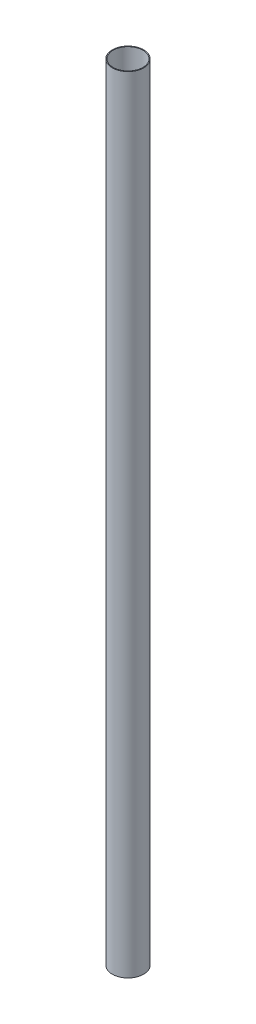
ISO-10303-21;
HEADER;
FILE_DESCRIPTION(('STEP AP214'),'2;1');
FILE_NAME('part.step','',(''),(''),'','','');
FILE_SCHEMA(('AUTOMOTIVE_DESIGN { 1 0 10303 214 1 1 1 1 }'));
ENDSEC;
DATA;
#1=APPLICATION_CONTEXT('core data for automotive mechanical design processes');
#2=APPLICATION_PROTOCOL_DEFINITION('international standard','automotive_design',2000,#1);
#3=PRODUCT_CONTEXT('',#1,'mechanical');
#4=PRODUCT('Part','Part','',(#3));
#5=PRODUCT_RELATED_PRODUCT_CATEGORY('part','',(#4));
#6=PRODUCT_DEFINITION_FORMATION('','',#4);
#7=PRODUCT_DEFINITION_CONTEXT('part definition',#1,'design');
#8=PRODUCT_DEFINITION('design','',#6,#7);
#9=PRODUCT_DEFINITION_SHAPE('','',#8);
#10=(LENGTH_UNIT() NAMED_UNIT(*) SI_UNIT(.MILLI.,.METRE.));
#11=(NAMED_UNIT(*) PLANE_ANGLE_UNIT() SI_UNIT($,.RADIAN.));
#12=(NAMED_UNIT(*) SI_UNIT($,.STERADIAN.) SOLID_ANGLE_UNIT());
#13=UNCERTAINTY_MEASURE_WITH_UNIT(LENGTH_MEASURE(1.E-05),#10,'distance_accuracy_value','');
#14=(GEOMETRIC_REPRESENTATION_CONTEXT(3) GLOBAL_UNCERTAINTY_ASSIGNED_CONTEXT((#13)) GLOBAL_UNIT_ASSIGNED_CONTEXT((#10,
#11,#12)) REPRESENTATION_CONTEXT('',''));
#15=CARTESIAN_POINT('',(0.,0.,0.));
#16=DIRECTION('',(0.,0.,1.));
#17=DIRECTION('',(1.,0.,0.));
#18=AXIS2_PLACEMENT_3D('',#15,#16,#17);
#19=CARTESIAN_POINT('',(0.,1000.,0.));
#20=DIRECTION('',(0.,1.,0.));
#21=DIRECTION('',(0.,0.,1.));
#22=AXIS2_PLACEMENT_3D('',#19,#20,#21);
#23=PLANE('',#22);
#24=CARTESIAN_POINT('',(0.,1000.,0.));
#25=DIRECTION('',(0.,1.,0.));
#26=DIRECTION('',(0.,0.,1.));
#27=AXIS2_PLACEMENT_3D('',#24,#25,#26);
#28=CIRCLE('',#27,20.);
#29=CARTESIAN_POINT('',(0.,1000.,20.));
#30=VERTEX_POINT('',#29);
#31=EDGE_CURVE('E10',#30,#30,#28,.T.);
#32=ORIENTED_EDGE('',*,*,#31,.T.);
#33=EDGE_LOOP('',(#32));
#34=FACE_BOUND('',#33,.T.);
#35=CARTESIAN_POINT('',(0.,1000.,0.));
#36=DIRECTION('',(0.,1.,0.));
#37=DIRECTION('',(0.,0.,1.));
#38=AXIS2_PLACEMENT_3D('',#35,#36,#37);
#39=CIRCLE('',#38,19.);
#40=CARTESIAN_POINT('',(0.,1000.,19.));
#41=VERTEX_POINT('',#40);
#42=EDGE_CURVE('E44',#41,#41,#39,.T.);
#43=ORIENTED_EDGE('',*,*,#42,.F.);
#44=EDGE_LOOP('',(#43));
#45=FACE_BOUND('',#44,.T.);
#46=ADVANCED_FACE('F33',(#34,#45),#23,.T.);
#47=CARTESIAN_POINT('',(0.,0.,0.));
#48=DIRECTION('',(0.,1.,0.));
#49=DIRECTION('',(0.,0.,1.));
#50=AXIS2_PLACEMENT_3D('',#47,#48,#49);
#51=PLANE('',#50);
#52=CARTESIAN_POINT('',(0.,0.,0.));
#53=DIRECTION('',(0.,1.,0.));
#54=DIRECTION('',(0.,0.,1.));
#55=AXIS2_PLACEMENT_3D('',#52,#53,#54);
#56=CIRCLE('',#55,20.);
#57=CARTESIAN_POINT('',(0.,0.,20.));
#58=VERTEX_POINT('',#57);
#59=EDGE_CURVE('E37',#58,#58,#56,.T.);
#60=ORIENTED_EDGE('',*,*,#59,.F.);
#61=EDGE_LOOP('',(#60));
#62=FACE_BOUND('',#61,.T.);
#63=CARTESIAN_POINT('',(0.,0.,0.));
#64=DIRECTION('',(0.,1.,0.));
#65=DIRECTION('',(0.,0.,1.));
#66=AXIS2_PLACEMENT_3D('',#63,#64,#65);
#67=CIRCLE('',#66,19.);
#68=CARTESIAN_POINT('',(0.,0.,19.));
#69=VERTEX_POINT('',#68);
#70=EDGE_CURVE('E46',#69,#69,#67,.T.);
#71=ORIENTED_EDGE('',*,*,#70,.T.);
#72=EDGE_LOOP('',(#71));
#73=FACE_BOUND('',#72,.T.);
#74=ADVANCED_FACE('F56',(#62,#73),#51,.F.);
#75=CARTESIAN_POINT('',(0.,1000.,0.));
#76=DIRECTION('',(0.,-1.,0.));
#77=DIRECTION('',(0.,0.,-1.));
#78=AXIS2_PLACEMENT_3D('',#75,#76,#77);
#79=CYLINDRICAL_SURFACE('',#78,20.);
#80=ORIENTED_EDGE('',*,*,#31,.F.);
#81=EDGE_LOOP('',(#80));
#82=FACE_BOUND('',#81,.T.);
#83=ORIENTED_EDGE('',*,*,#59,.T.);
#84=EDGE_LOOP('',(#83));
#85=FACE_BOUND('',#84,.T.);
#86=ADVANCED_FACE('F35',(#82,#85),#79,.T.);
#87=CARTESIAN_POINT('',(0.,1000.,0.));
#88=DIRECTION('',(0.,-1.,0.));
#89=DIRECTION('',(0.,0.,-1.));
#90=AXIS2_PLACEMENT_3D('',#87,#88,#89);
#91=CYLINDRICAL_SURFACE('',#90,19.);
#92=ORIENTED_EDGE('',*,*,#42,.T.);
#93=EDGE_LOOP('',(#92));
#94=FACE_BOUND('',#93,.T.);
#95=ORIENTED_EDGE('',*,*,#70,.F.);
#96=EDGE_LOOP('',(#95));
#97=FACE_BOUND('',#96,.T.);
#98=ADVANCED_FACE('F52',(#94,#97),#91,.F.);
#99=CLOSED_SHELL('',(#46,#74,#86,#98));
#100=MANIFOLD_SOLID_BREP('B2',#99);
#101=ADVANCED_BREP_SHAPE_REPRESENTATION('',(#18,#100),#14);
#102=SHAPE_DEFINITION_REPRESENTATION(#9,#101);
ENDSEC;
END-ISO-10303-21;
